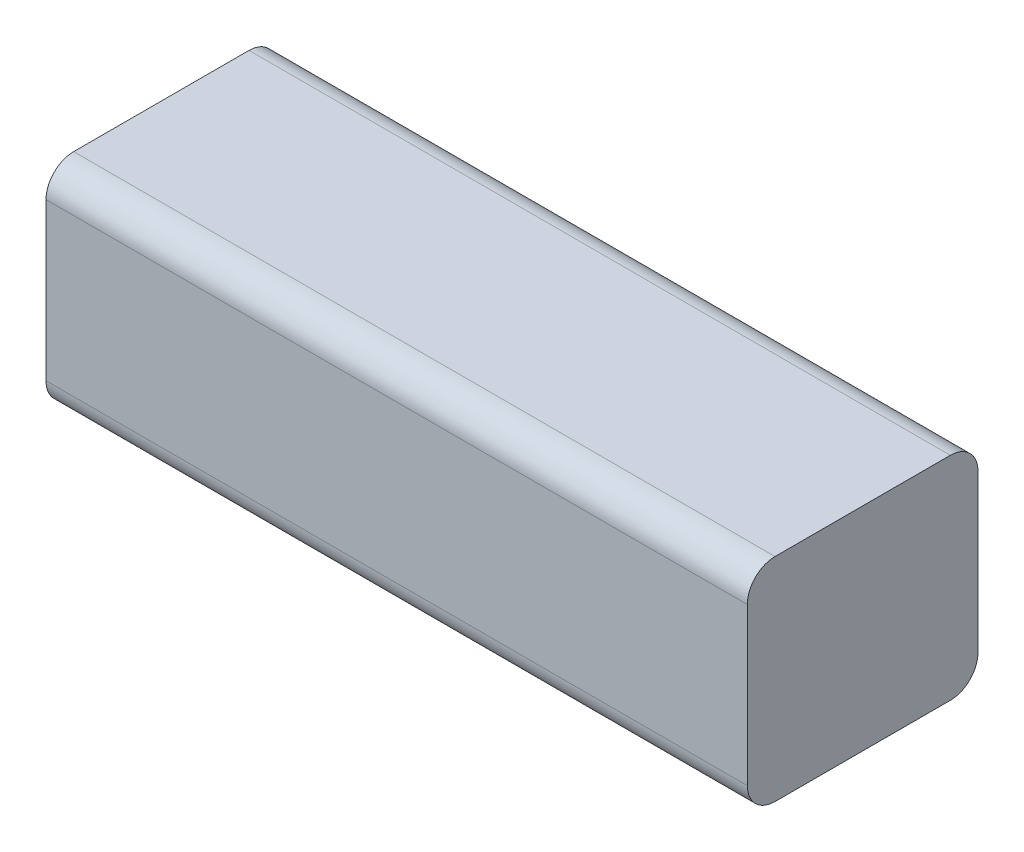
ISO-10303-21;
HEADER;
FILE_DESCRIPTION(('STEP AP214'),'2;1');
FILE_NAME('part.step','',(''),(''),'','','');
FILE_SCHEMA(('AUTOMOTIVE_DESIGN { 1 0 10303 214 1 1 1 1 }'));
ENDSEC;
DATA;
#1=APPLICATION_CONTEXT('core data for automotive mechanical design processes');
#2=APPLICATION_PROTOCOL_DEFINITION('international standard','automotive_design',2000,#1);
#3=PRODUCT_CONTEXT('',#1,'mechanical');
#4=PRODUCT('Part','Part','',(#3));
#5=PRODUCT_RELATED_PRODUCT_CATEGORY('part','',(#4));
#6=PRODUCT_DEFINITION_FORMATION('','',#4);
#7=PRODUCT_DEFINITION_CONTEXT('part definition',#1,'design');
#8=PRODUCT_DEFINITION('design','',#6,#7);
#9=PRODUCT_DEFINITION_SHAPE('','',#8);
#10=(LENGTH_UNIT() NAMED_UNIT(*) SI_UNIT(.MILLI.,.METRE.));
#11=(NAMED_UNIT(*) PLANE_ANGLE_UNIT() SI_UNIT($,.RADIAN.));
#12=(NAMED_UNIT(*) SI_UNIT($,.STERADIAN.) SOLID_ANGLE_UNIT());
#13=UNCERTAINTY_MEASURE_WITH_UNIT(LENGTH_MEASURE(1.E-05),#10,'distance_accuracy_value','');
#14=(GEOMETRIC_REPRESENTATION_CONTEXT(3) GLOBAL_UNCERTAINTY_ASSIGNED_CONTEXT((#13)) GLOBAL_UNIT_ASSIGNED_CONTEXT((#10,
#11,#12)) REPRESENTATION_CONTEXT('',''));
#15=CARTESIAN_POINT('',(0.,0.,0.));
#16=DIRECTION('',(0.,0.,1.));
#17=DIRECTION('',(1.,0.,0.));
#18=AXIS2_PLACEMENT_3D('',#15,#16,#17);
#19=CARTESIAN_POINT('',(38.,23.,-12.5));
#20=DIRECTION('',(-1.,0.,0.));
#21=DIRECTION('',(0.,0.,1.));
#22=AXIS2_PLACEMENT_3D('',#19,#20,#21);
#23=PLANE('',#22);
#24=DIRECTION('',(0.,0.,-1.));
#25=VECTOR('',#24,1.);
#26=CARTESIAN_POINT('',(38.,0.,-12.5));
#27=LINE('',#26,#25);
#28=CARTESIAN_POINT('',(38.,0.,9.49999999999999));
#29=VERTEX_POINT('',#28);
#30=CARTESIAN_POINT('',(38.,0.,-9.50000000000001));
#31=VERTEX_POINT('',#30);
#32=EDGE_CURVE('E187',#29,#31,#27,.T.);
#33=ORIENTED_EDGE('',*,*,#32,.T.);
#34=CARTESIAN_POINT('',(38.,3.,-9.50000000000001));
#35=DIRECTION('',(-1.,0.,0.));
#36=DIRECTION('',(0.,0.,1.));
#37=AXIS2_PLACEMENT_3D('',#34,#35,#36);
#38=CIRCLE('',#37,3.);
#39=CARTESIAN_POINT('',(38.,3.,-12.5));
#40=VERTEX_POINT('',#39);
#41=EDGE_CURVE('E161',#31,#40,#38,.F.);
#42=ORIENTED_EDGE('',*,*,#41,.T.);
#43=DIRECTION('',(0.,-1.,0.));
#44=VECTOR('',#43,1.);
#45=CARTESIAN_POINT('',(38.,23.,-12.5));
#46=LINE('',#45,#44);
#47=CARTESIAN_POINT('',(38.,20.,-12.5));
#48=VERTEX_POINT('',#47);
#49=EDGE_CURVE('E129',#48,#40,#46,.T.);
#50=ORIENTED_EDGE('',*,*,#49,.F.);
#51=CARTESIAN_POINT('',(38.,20.,-9.50000000000001));
#52=DIRECTION('',(-1.,0.,0.));
#53=DIRECTION('',(0.,0.,1.));
#54=AXIS2_PLACEMENT_3D('',#51,#52,#53);
#55=CIRCLE('',#54,3.);
#56=CARTESIAN_POINT('',(38.,23.,-9.50000000000001));
#57=VERTEX_POINT('',#56);
#58=EDGE_CURVE('E134',#48,#57,#55,.F.);
#59=ORIENTED_EDGE('',*,*,#58,.T.);
#60=DIRECTION('',(0.,0.,-1.));
#61=VECTOR('',#60,1.);
#62=CARTESIAN_POINT('',(38.,23.,-12.5));
#63=LINE('',#62,#61);
#64=CARTESIAN_POINT('',(38.,23.,9.49999999999999));
#65=VERTEX_POINT('',#64);
#66=EDGE_CURVE('E175',#65,#57,#63,.T.);
#67=ORIENTED_EDGE('',*,*,#66,.F.);
#68=CARTESIAN_POINT('',(38.,20.,9.49999999999999));
#69=DIRECTION('',(-1.,0.,0.));
#70=DIRECTION('',(0.,0.,1.));
#71=AXIS2_PLACEMENT_3D('',#68,#69,#70);
#72=CIRCLE('',#71,3.);
#73=CARTESIAN_POINT('',(38.,20.,12.5));
#74=VERTEX_POINT('',#73);
#75=EDGE_CURVE('E63',#65,#74,#72,.F.);
#76=ORIENTED_EDGE('',*,*,#75,.T.);
#77=DIRECTION('',(0.,-1.,0.));
#78=VECTOR('',#77,1.);
#79=CARTESIAN_POINT('',(38.,23.,12.5));
#80=LINE('',#79,#78);
#81=CARTESIAN_POINT('',(38.,3.,12.5));
#82=VERTEX_POINT('',#81);
#83=EDGE_CURVE('E184',#74,#82,#80,.T.);
#84=ORIENTED_EDGE('',*,*,#83,.T.);
#85=CARTESIAN_POINT('',(38.,3.,9.49999999999999));
#86=DIRECTION('',(-1.,0.,0.));
#87=DIRECTION('',(0.,0.,1.));
#88=AXIS2_PLACEMENT_3D('',#85,#86,#87);
#89=CIRCLE('',#88,3.);
#90=EDGE_CURVE('E55',#82,#29,#89,.F.);
#91=ORIENTED_EDGE('',*,*,#90,.T.);
#92=EDGE_LOOP('',(#33,#42,#50,#59,#67,#76,#84,#91));
#93=FACE_BOUND('',#92,.T.);
#94=ADVANCED_FACE('F39',(#93),#23,.F.);
#95=CARTESIAN_POINT('',(-38.,23.,-12.5));
#96=DIRECTION('',(0.,0.,1.));
#97=DIRECTION('',(1.,0.,0.));
#98=AXIS2_PLACEMENT_3D('',#95,#96,#97);
#99=PLANE('',#98);
#100=ORIENTED_EDGE('',*,*,#49,.T.);
#101=DIRECTION('',(-1.,0.,0.));
#102=VECTOR('',#101,1.);
#103=CARTESIAN_POINT('',(-38.,3.,-12.5));
#104=LINE('',#103,#102);
#105=CARTESIAN_POINT('',(-38.,3.,-12.5));
#106=VERTEX_POINT('',#105);
#107=EDGE_CURVE('E127',#40,#106,#104,.T.);
#108=ORIENTED_EDGE('',*,*,#107,.T.);
#109=DIRECTION('',(0.,-1.,0.));
#110=VECTOR('',#109,1.);
#111=CARTESIAN_POINT('',(-38.,23.,-12.5));
#112=LINE('',#111,#110);
#113=CARTESIAN_POINT('',(-38.,20.,-12.5));
#114=VERTEX_POINT('',#113);
#115=EDGE_CURVE('E110',#114,#106,#112,.T.);
#116=ORIENTED_EDGE('',*,*,#115,.F.);
#117=DIRECTION('',(-1.,0.,0.));
#118=VECTOR('',#117,1.);
#119=CARTESIAN_POINT('',(38.,20.,-12.5));
#120=LINE('',#119,#118);
#121=EDGE_CURVE('E124',#114,#48,#120,.F.);
#122=ORIENTED_EDGE('',*,*,#121,.T.);
#123=EDGE_LOOP('',(#100,#108,#116,#122));
#124=FACE_BOUND('',#123,.T.);
#125=ADVANCED_FACE('F123',(#124),#99,.F.);
#126=CARTESIAN_POINT('',(-38.,23.,-12.5));
#127=DIRECTION('',(1.,0.,0.));
#128=DIRECTION('',(0.,0.,-1.));
#129=AXIS2_PLACEMENT_3D('',#126,#127,#128);
#130=PLANE('',#129);
#131=ORIENTED_EDGE('',*,*,#115,.T.);
#132=CARTESIAN_POINT('',(-38.,3.,-9.50000000000001));
#133=DIRECTION('',(1.,0.,0.));
#134=DIRECTION('',(0.,0.,-1.));
#135=AXIS2_PLACEMENT_3D('',#132,#133,#134);
#136=CIRCLE('',#135,3.);
#137=CARTESIAN_POINT('',(-38.,0.,-9.50000000000001));
#138=VERTEX_POINT('',#137);
#139=EDGE_CURVE('E146',#106,#138,#136,.F.);
#140=ORIENTED_EDGE('',*,*,#139,.T.);
#141=DIRECTION('',(0.,0.,1.));
#142=VECTOR('',#141,1.);
#143=CARTESIAN_POINT('',(-38.,0.,-12.5));
#144=LINE('',#143,#142);
#145=CARTESIAN_POINT('',(-38.,0.,9.49999999999999));
#146=VERTEX_POINT('',#145);
#147=EDGE_CURVE('E180',#138,#146,#144,.T.);
#148=ORIENTED_EDGE('',*,*,#147,.T.);
#149=CARTESIAN_POINT('',(-38.,3.,9.49999999999999));
#150=DIRECTION('',(1.,0.,0.));
#151=DIRECTION('',(0.,0.,-1.));
#152=AXIS2_PLACEMENT_3D('',#149,#150,#151);
#153=CIRCLE('',#152,3.);
#154=CARTESIAN_POINT('',(-38.,3.,12.5));
#155=VERTEX_POINT('',#154);
#156=EDGE_CURVE('E117',#146,#155,#153,.F.);
#157=ORIENTED_EDGE('',*,*,#156,.T.);
#158=DIRECTION('',(0.,-1.,0.));
#159=VECTOR('',#158,1.);
#160=CARTESIAN_POINT('',(-38.,23.,12.5));
#161=LINE('',#160,#159);
#162=CARTESIAN_POINT('',(-38.,20.,12.5));
#163=VERTEX_POINT('',#162);
#164=EDGE_CURVE('E130',#163,#155,#161,.T.);
#165=ORIENTED_EDGE('',*,*,#164,.F.);
#166=CARTESIAN_POINT('',(-38.,20.,9.49999999999999));
#167=DIRECTION('',(1.,0.,0.));
#168=DIRECTION('',(0.,0.,-1.));
#169=AXIS2_PLACEMENT_3D('',#166,#167,#168);
#170=CIRCLE('',#169,3.);
#171=CARTESIAN_POINT('',(-38.,23.,9.49999999999999));
#172=VERTEX_POINT('',#171);
#173=EDGE_CURVE('E118',#163,#172,#170,.F.);
#174=ORIENTED_EDGE('',*,*,#173,.T.);
#175=DIRECTION('',(0.,0.,1.));
#176=VECTOR('',#175,1.);
#177=CARTESIAN_POINT('',(-38.,23.,-12.5));
#178=LINE('',#177,#176);
#179=CARTESIAN_POINT('',(-38.,23.,-9.50000000000001));
#180=VERTEX_POINT('',#179);
#181=EDGE_CURVE('E112',#180,#172,#178,.T.);
#182=ORIENTED_EDGE('',*,*,#181,.F.);
#183=CARTESIAN_POINT('',(-38.,20.,-9.50000000000001));
#184=DIRECTION('',(1.,0.,0.));
#185=DIRECTION('',(0.,0.,-1.));
#186=AXIS2_PLACEMENT_3D('',#183,#184,#185);
#187=CIRCLE('',#186,3.);
#188=EDGE_CURVE('E107',#180,#114,#187,.F.);
#189=ORIENTED_EDGE('',*,*,#188,.T.);
#190=EDGE_LOOP('',(#131,#140,#148,#157,#165,#174,#182,#189));
#191=FACE_BOUND('',#190,.T.);
#192=ADVANCED_FACE('F109',(#191),#130,.F.);
#193=CARTESIAN_POINT('',(-38.,23.,12.5));
#194=DIRECTION('',(0.,0.,-1.));
#195=DIRECTION('',(-1.,0.,0.));
#196=AXIS2_PLACEMENT_3D('',#193,#194,#195);
#197=PLANE('',#196);
#198=ORIENTED_EDGE('',*,*,#164,.T.);
#199=DIRECTION('',(1.,0.,0.));
#200=VECTOR('',#199,1.);
#201=CARTESIAN_POINT('',(-38.,3.,12.5));
#202=LINE('',#201,#200);
#203=EDGE_CURVE('E167',#155,#82,#202,.T.);
#204=ORIENTED_EDGE('',*,*,#203,.T.);
#205=ORIENTED_EDGE('',*,*,#83,.F.);
#206=DIRECTION('',(1.,0.,0.));
#207=VECTOR('',#206,1.);
#208=CARTESIAN_POINT('',(-38.,20.,12.5));
#209=LINE('',#208,#207);
#210=EDGE_CURVE('E164',#74,#163,#209,.F.);
#211=ORIENTED_EDGE('',*,*,#210,.T.);
#212=EDGE_LOOP('',(#198,#204,#205,#211));
#213=FACE_BOUND('',#212,.T.);
#214=ADVANCED_FACE('F198',(#213),#197,.F.);
#215=CARTESIAN_POINT('',(0.,23.,0.));
#216=DIRECTION('',(0.,1.,0.));
#217=DIRECTION('',(0.,0.,1.));
#218=AXIS2_PLACEMENT_3D('',#215,#216,#217);
#219=PLANE('',#218);
#220=ORIENTED_EDGE('',*,*,#66,.T.);
#221=DIRECTION('',(-1.,0.,0.));
#222=VECTOR('',#221,1.);
#223=CARTESIAN_POINT('',(-38.,23.,-9.50000000000001));
#224=LINE('',#223,#222);
#225=EDGE_CURVE('E11',#57,#180,#224,.T.);
#226=ORIENTED_EDGE('',*,*,#225,.T.);
#227=ORIENTED_EDGE('',*,*,#181,.T.);
#228=DIRECTION('',(1.,0.,0.));
#229=VECTOR('',#228,1.);
#230=CARTESIAN_POINT('',(38.,23.,9.49999999999999));
#231=LINE('',#230,#229);
#232=EDGE_CURVE('E48',#172,#65,#231,.T.);
#233=ORIENTED_EDGE('',*,*,#232,.T.);
#234=EDGE_LOOP('',(#220,#226,#227,#233));
#235=FACE_BOUND('',#234,.T.);
#236=ADVANCED_FACE('F174',(#235),#219,.T.);
#237=CARTESIAN_POINT('',(0.,0.,0.));
#238=DIRECTION('',(0.,1.,0.));
#239=DIRECTION('',(0.,0.,1.));
#240=AXIS2_PLACEMENT_3D('',#237,#238,#239);
#241=PLANE('',#240);
#242=ORIENTED_EDGE('',*,*,#147,.F.);
#243=DIRECTION('',(-1.,0.,0.));
#244=VECTOR('',#243,1.);
#245=CARTESIAN_POINT('',(0.,0.,-9.50000000000001));
#246=LINE('',#245,#244);
#247=EDGE_CURVE('E152',#138,#31,#246,.F.);
#248=ORIENTED_EDGE('',*,*,#247,.T.);
#249=ORIENTED_EDGE('',*,*,#32,.F.);
#250=DIRECTION('',(1.,0.,0.));
#251=VECTOR('',#250,1.);
#252=CARTESIAN_POINT('',(0.,0.,9.49999999999999));
#253=LINE('',#252,#251);
#254=EDGE_CURVE('E149',#29,#146,#253,.F.);
#255=ORIENTED_EDGE('',*,*,#254,.T.);
#256=EDGE_LOOP('',(#242,#248,#249,#255));
#257=FACE_BOUND('',#256,.T.);
#258=ADVANCED_FACE('F205',(#257),#241,.F.);
#259=CARTESIAN_POINT('',(-38.,3.,-9.50000000000001));
#260=DIRECTION('',(-1.,0.,0.));
#261=DIRECTION('',(0.,0.,1.));
#262=AXIS2_PLACEMENT_3D('',#259,#260,#261);
#263=CYLINDRICAL_SURFACE('',#262,3.);
#264=ORIENTED_EDGE('',*,*,#41,.F.);
#265=ORIENTED_EDGE('',*,*,#247,.F.);
#266=ORIENTED_EDGE('',*,*,#139,.F.);
#267=ORIENTED_EDGE('',*,*,#107,.F.);
#268=EDGE_LOOP('',(#264,#265,#266,#267));
#269=FACE_BOUND('',#268,.T.);
#270=ADVANCED_FACE('F209',(#269),#263,.T.);
#271=CARTESIAN_POINT('',(-38.,3.,9.49999999999999));
#272=DIRECTION('',(1.,0.,0.));
#273=DIRECTION('',(0.,0.,-1.));
#274=AXIS2_PLACEMENT_3D('',#271,#272,#273);
#275=CYLINDRICAL_SURFACE('',#274,3.);
#276=ORIENTED_EDGE('',*,*,#156,.F.);
#277=ORIENTED_EDGE('',*,*,#254,.F.);
#278=ORIENTED_EDGE('',*,*,#90,.F.);
#279=ORIENTED_EDGE('',*,*,#203,.F.);
#280=EDGE_LOOP('',(#276,#277,#278,#279));
#281=FACE_BOUND('',#280,.T.);
#282=ADVANCED_FACE('F201',(#281),#275,.T.);
#283=CARTESIAN_POINT('',(0.,20.,-9.50000000000001));
#284=DIRECTION('',(1.,0.,0.));
#285=DIRECTION('',(0.,0.,-1.));
#286=AXIS2_PLACEMENT_3D('',#283,#284,#285);
#287=CYLINDRICAL_SURFACE('',#286,3.);
#288=ORIENTED_EDGE('',*,*,#58,.F.);
#289=ORIENTED_EDGE('',*,*,#121,.F.);
#290=ORIENTED_EDGE('',*,*,#188,.F.);
#291=ORIENTED_EDGE('',*,*,#225,.F.);
#292=EDGE_LOOP('',(#288,#289,#290,#291));
#293=FACE_BOUND('',#292,.T.);
#294=ADVANCED_FACE('F133',(#293),#287,.T.);
#295=CARTESIAN_POINT('',(0.,20.,9.49999999999999));
#296=DIRECTION('',(-1.,0.,0.));
#297=DIRECTION('',(0.,0.,1.));
#298=AXIS2_PLACEMENT_3D('',#295,#296,#297);
#299=CYLINDRICAL_SURFACE('',#298,3.);
#300=ORIENTED_EDGE('',*,*,#173,.F.);
#301=ORIENTED_EDGE('',*,*,#210,.F.);
#302=ORIENTED_EDGE('',*,*,#75,.F.);
#303=ORIENTED_EDGE('',*,*,#232,.F.);
#304=EDGE_LOOP('',(#300,#301,#302,#303));
#305=FACE_BOUND('',#304,.T.);
#306=ADVANCED_FACE('F41',(#305),#299,.T.);
#307=CLOSED_SHELL('',(#94,#125,#192,#214,#236,#258,#270,#282,#294,#306));
#308=MANIFOLD_SOLID_BREP('B2',#307);
#309=ADVANCED_BREP_SHAPE_REPRESENTATION('',(#18,#308),#14);
#310=SHAPE_DEFINITION_REPRESENTATION(#9,#309);
ENDSEC;
END-ISO-10303-21;
